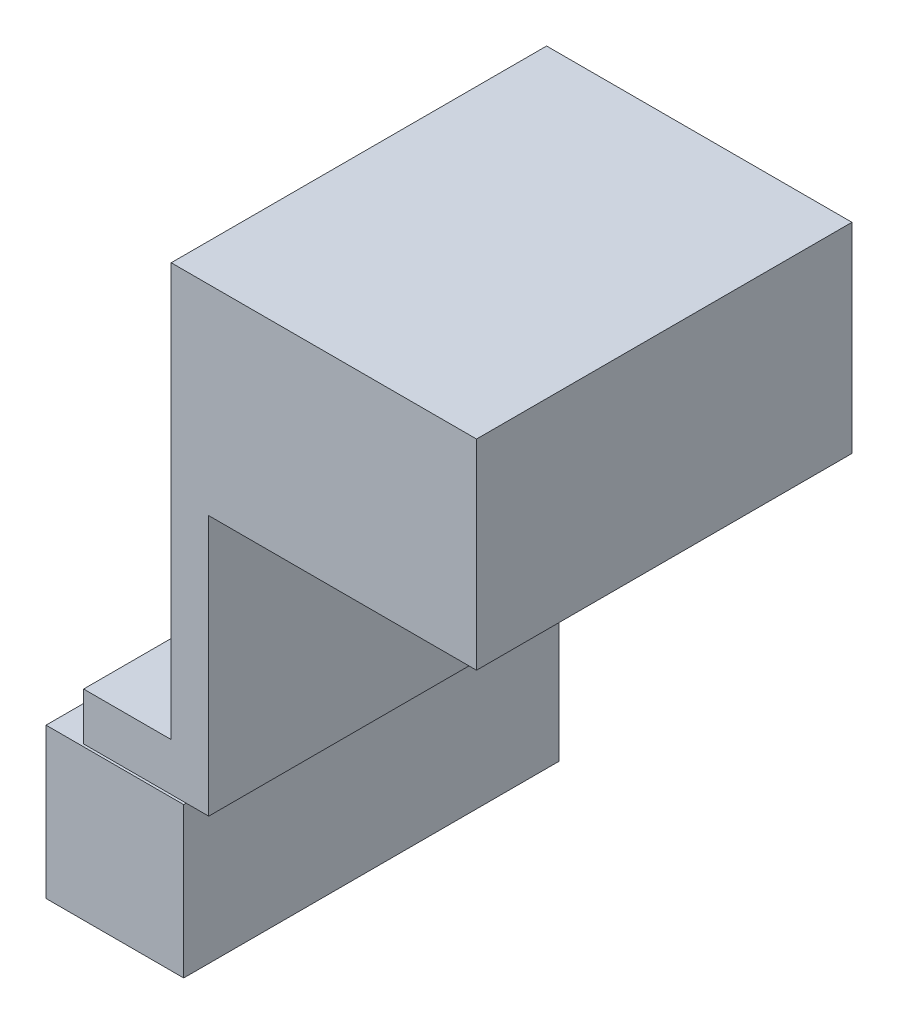
ISO-10303-21;
HEADER;
FILE_DESCRIPTION(('STEP AP214'),'2;1');
FILE_NAME('part.step','',(''),(''),'','','');
FILE_SCHEMA(('AUTOMOTIVE_DESIGN { 1 0 10303 214 1 1 1 1 }'));
ENDSEC;
DATA;
#1=APPLICATION_CONTEXT('core data for automotive mechanical design processes');
#2=APPLICATION_PROTOCOL_DEFINITION('international standard','automotive_design',2000,#1);
#3=PRODUCT_CONTEXT('',#1,'mechanical');
#4=PRODUCT('Part','Part','',(#3));
#5=PRODUCT_RELATED_PRODUCT_CATEGORY('part','',(#4));
#6=PRODUCT_DEFINITION_FORMATION('','',#4);
#7=PRODUCT_DEFINITION_CONTEXT('part definition',#1,'design');
#8=PRODUCT_DEFINITION('design','',#6,#7);
#9=PRODUCT_DEFINITION_SHAPE('','',#8);
#10=(LENGTH_UNIT() NAMED_UNIT(*) SI_UNIT(.MILLI.,.METRE.));
#11=(NAMED_UNIT(*) PLANE_ANGLE_UNIT() SI_UNIT($,.RADIAN.));
#12=(NAMED_UNIT(*) SI_UNIT($,.STERADIAN.) SOLID_ANGLE_UNIT());
#13=UNCERTAINTY_MEASURE_WITH_UNIT(LENGTH_MEASURE(1.E-05),#10,'distance_accuracy_value','');
#14=(GEOMETRIC_REPRESENTATION_CONTEXT(3) GLOBAL_UNCERTAINTY_ASSIGNED_CONTEXT((#13)) GLOBAL_UNIT_ASSIGNED_CONTEXT((#10,
#11,#12)) REPRESENTATION_CONTEXT('',''));
#15=CARTESIAN_POINT('',(0.,0.,0.));
#16=DIRECTION('',(0.,0.,1.));
#17=DIRECTION('',(1.,0.,0.));
#18=AXIS2_PLACEMENT_3D('',#15,#16,#17);
#19=CARTESIAN_POINT('',(40.,0.,150.));
#20=DIRECTION('',(1.,0.,0.));
#21=DIRECTION('',(0.,1.,0.));
#22=AXIS2_PLACEMENT_3D('',#19,#20,#21);
#23=PLANE('',#22);
#24=DIRECTION('',(0.,-1.,0.));
#25=VECTOR('',#24,1.);
#26=CARTESIAN_POINT('',(40.,0.,0.));
#27=LINE('',#26,#25);
#28=CARTESIAN_POINT('',(40.,-1.,0.));
#29=VERTEX_POINT('',#28);
#30=CARTESIAN_POINT('',(40.,-61.,0.));
#31=VERTEX_POINT('',#30);
#32=EDGE_CURVE('E106',#29,#31,#27,.T.);
#33=ORIENTED_EDGE('',*,*,#32,.F.);
#34=DIRECTION('',(0.,0.,-1.));
#35=VECTOR('',#34,1.);
#36=CARTESIAN_POINT('',(40.,-1.,150.));
#37=LINE('',#36,#35);
#38=CARTESIAN_POINT('',(40.,-1.,150.));
#39=VERTEX_POINT('',#38);
#40=EDGE_CURVE('E12',#39,#29,#37,.T.);
#41=ORIENTED_EDGE('',*,*,#40,.F.);
#42=DIRECTION('',(0.,-1.,0.));
#43=VECTOR('',#42,1.);
#44=CARTESIAN_POINT('',(40.,0.,150.));
#45=LINE('',#44,#43);
#46=CARTESIAN_POINT('',(40.,-61.,150.));
#47=VERTEX_POINT('',#46);
#48=EDGE_CURVE('E100',#39,#47,#45,.T.);
#49=ORIENTED_EDGE('',*,*,#48,.T.);
#50=DIRECTION('',(0.,0.,-1.));
#51=VECTOR('',#50,1.);
#52=CARTESIAN_POINT('',(40.,-61.,150.));
#53=LINE('',#52,#51);
#54=EDGE_CURVE('E81',#47,#31,#53,.T.);
#55=ORIENTED_EDGE('',*,*,#54,.T.);
#56=EDGE_LOOP('',(#33,#41,#49,#55));
#57=FACE_BOUND('',#56,.T.);
#58=ADVANCED_FACE('F43',(#57),#23,.T.);
#59=CARTESIAN_POINT('',(0.,-1.,150.));
#60=DIRECTION('',(0.,1.,0.));
#61=DIRECTION('',(0.,0.,1.));
#62=AXIS2_PLACEMENT_3D('',#59,#60,#61);
#63=PLANE('',#62);
#64=DIRECTION('',(1.,0.,0.));
#65=VECTOR('',#64,1.);
#66=CARTESIAN_POINT('',(0.,-1.,0.));
#67=LINE('',#66,#65);
#68=CARTESIAN_POINT('',(-15.,-1.,0.));
#69=VERTEX_POINT('',#68);
#70=EDGE_CURVE('E94',#69,#29,#67,.T.);
#71=ORIENTED_EDGE('',*,*,#70,.F.);
#72=DIRECTION('',(0.,0.,-1.));
#73=VECTOR('',#72,1.);
#74=CARTESIAN_POINT('',(-15.,-1.,150.));
#75=LINE('',#74,#73);
#76=CARTESIAN_POINT('',(-15.,-1.,150.));
#77=VERTEX_POINT('',#76);
#78=EDGE_CURVE('E51',#77,#69,#75,.T.);
#79=ORIENTED_EDGE('',*,*,#78,.F.);
#80=DIRECTION('',(1.,0.,0.));
#81=VECTOR('',#80,1.);
#82=CARTESIAN_POINT('',(0.,-1.,150.));
#83=LINE('',#82,#81);
#84=EDGE_CURVE('E92',#77,#39,#83,.T.);
#85=ORIENTED_EDGE('',*,*,#84,.T.);
#86=ORIENTED_EDGE('',*,*,#40,.T.);
#87=EDGE_LOOP('',(#71,#79,#85,#86));
#88=FACE_BOUND('',#87,.T.);
#89=ADVANCED_FACE('F90',(#88),#63,.T.);
#90=CARTESIAN_POINT('',(-15.,0.,150.));
#91=DIRECTION('',(1.,0.,0.));
#92=DIRECTION('',(0.,1.,0.));
#93=AXIS2_PLACEMENT_3D('',#90,#91,#92);
#94=PLANE('',#93);
#95=DIRECTION('',(0.,-1.,0.));
#96=VECTOR('',#95,1.);
#97=CARTESIAN_POINT('',(-15.,0.,0.));
#98=LINE('',#97,#96);
#99=CARTESIAN_POINT('',(-15.,-61.,0.));
#100=VERTEX_POINT('',#99);
#101=EDGE_CURVE('E74',#69,#100,#98,.T.);
#102=ORIENTED_EDGE('',*,*,#101,.T.);
#103=DIRECTION('',(0.,0.,-1.));
#104=VECTOR('',#103,1.);
#105=CARTESIAN_POINT('',(-15.,-61.,150.));
#106=LINE('',#105,#104);
#107=CARTESIAN_POINT('',(-15.,-61.,150.));
#108=VERTEX_POINT('',#107);
#109=EDGE_CURVE('E95',#108,#100,#106,.T.);
#110=ORIENTED_EDGE('',*,*,#109,.F.);
#111=DIRECTION('',(0.,-1.,0.));
#112=VECTOR('',#111,1.);
#113=CARTESIAN_POINT('',(-15.,0.,150.));
#114=LINE('',#113,#112);
#115=EDGE_CURVE('E96',#77,#108,#114,.T.);
#116=ORIENTED_EDGE('',*,*,#115,.F.);
#117=ORIENTED_EDGE('',*,*,#78,.T.);
#118=EDGE_LOOP('',(#102,#110,#116,#117));
#119=FACE_BOUND('',#118,.T.);
#120=ADVANCED_FACE('F97',(#119),#94,.F.);
#121=CARTESIAN_POINT('',(0.,-61.,150.));
#122=DIRECTION('',(0.,1.,0.));
#123=DIRECTION('',(0.,0.,1.));
#124=AXIS2_PLACEMENT_3D('',#121,#122,#123);
#125=PLANE('',#124);
#126=DIRECTION('',(1.,0.,0.));
#127=VECTOR('',#126,1.);
#128=CARTESIAN_POINT('',(0.,-61.,0.));
#129=LINE('',#128,#127);
#130=EDGE_CURVE('E102',#100,#31,#129,.T.);
#131=ORIENTED_EDGE('',*,*,#130,.T.);
#132=ORIENTED_EDGE('',*,*,#54,.F.);
#133=DIRECTION('',(1.,0.,0.));
#134=VECTOR('',#133,1.);
#135=CARTESIAN_POINT('',(0.,-61.,150.));
#136=LINE('',#135,#134);
#137=EDGE_CURVE('E59',#108,#47,#136,.T.);
#138=ORIENTED_EDGE('',*,*,#137,.F.);
#139=ORIENTED_EDGE('',*,*,#109,.T.);
#140=EDGE_LOOP('',(#131,#132,#138,#139));
#141=FACE_BOUND('',#140,.T.);
#142=ADVANCED_FACE('F115',(#141),#125,.F.);
#143=CARTESIAN_POINT('',(0.,0.,150.));
#144=DIRECTION('',(0.,0.,1.));
#145=DIRECTION('',(1.,0.,0.));
#146=AXIS2_PLACEMENT_3D('',#143,#144,#145);
#147=PLANE('',#146);
#148=ORIENTED_EDGE('',*,*,#48,.F.);
#149=ORIENTED_EDGE('',*,*,#84,.F.);
#150=ORIENTED_EDGE('',*,*,#115,.T.);
#151=ORIENTED_EDGE('',*,*,#137,.T.);
#152=EDGE_LOOP('',(#148,#149,#150,#151));
#153=FACE_BOUND('',#152,.T.);
#154=ADVANCED_FACE('F99',(#153),#147,.T.);
#155=CARTESIAN_POINT('',(0.,0.,0.));
#156=DIRECTION('',(0.,0.,1.));
#157=DIRECTION('',(1.,0.,0.));
#158=AXIS2_PLACEMENT_3D('',#155,#156,#157);
#159=PLANE('',#158);
#160=ORIENTED_EDGE('',*,*,#32,.T.);
#161=ORIENTED_EDGE('',*,*,#130,.F.);
#162=ORIENTED_EDGE('',*,*,#101,.F.);
#163=ORIENTED_EDGE('',*,*,#70,.T.);
#164=EDGE_LOOP('',(#160,#161,#162,#163));
#165=FACE_BOUND('',#164,.T.);
#166=ADVANCED_FACE('F117',(#165),#159,.F.);
#167=CLOSED_SHELL('',(#58,#89,#120,#142,#154,#166));
#168=MANIFOLD_SOLID_BREP('B2',#167);
#169=CARTESIAN_POINT('',(0.,0.,150.));
#170=DIRECTION('',(0.,1.,0.));
#171=DIRECTION('',(0.,0.,1.));
#172=AXIS2_PLACEMENT_3D('',#169,#170,#171);
#173=PLANE('',#172);
#174=DIRECTION('',(1.,0.,0.));
#175=VECTOR('',#174,1.);
#176=CARTESIAN_POINT('',(0.,0.,0.));
#177=LINE('',#176,#175);
#178=CARTESIAN_POINT('',(0.,0.,0.));
#179=VERTEX_POINT('',#178);
#180=CARTESIAN_POINT('',(50.,0.,0.));
#181=VERTEX_POINT('',#180);
#182=EDGE_CURVE('E264',#179,#181,#177,.T.);
#183=ORIENTED_EDGE('',*,*,#182,.T.);
#184=DIRECTION('',(0.,0.,-1.));
#185=VECTOR('',#184,1.);
#186=CARTESIAN_POINT('',(50.,0.,150.));
#187=LINE('',#186,#185);
#188=CARTESIAN_POINT('',(50.,0.,150.));
#189=VERTEX_POINT('',#188);
#190=EDGE_CURVE('E41',#189,#181,#187,.T.);
#191=ORIENTED_EDGE('',*,*,#190,.F.);
#192=DIRECTION('',(1.,0.,0.));
#193=VECTOR('',#192,1.);
#194=CARTESIAN_POINT('',(0.,0.,150.));
#195=LINE('',#194,#193);
#196=CARTESIAN_POINT('',(0.,0.,150.));
#197=VERTEX_POINT('',#196);
#198=EDGE_CURVE('E283',#197,#189,#195,.T.);
#199=ORIENTED_EDGE('',*,*,#198,.F.);
#200=DIRECTION('',(0.,0.,-1.));
#201=VECTOR('',#200,1.);
#202=CARTESIAN_POINT('',(0.,0.,150.));
#203=LINE('',#202,#201);
#204=EDGE_CURVE('E183',#197,#179,#203,.T.);
#205=ORIENTED_EDGE('',*,*,#204,.T.);
#206=EDGE_LOOP('',(#183,#191,#199,#205));
#207=FACE_BOUND('',#206,.T.);
#208=ADVANCED_FACE('F167',(#207),#173,.F.);
#209=CARTESIAN_POINT('',(50.,0.,150.));
#210=DIRECTION('',(-1.,0.,0.));
#211=DIRECTION('',(0.,0.,1.));
#212=AXIS2_PLACEMENT_3D('',#209,#210,#211);
#213=PLANE('',#212);
#214=DIRECTION('',(0.,1.,0.));
#215=VECTOR('',#214,1.);
#216=CARTESIAN_POINT('',(50.,0.,0.));
#217=LINE('',#216,#215);
#218=CARTESIAN_POINT('',(50.,104.,0.));
#219=VERTEX_POINT('',#218);
#220=EDGE_CURVE('E266',#181,#219,#217,.T.);
#221=ORIENTED_EDGE('',*,*,#220,.T.);
#222=DIRECTION('',(0.,0.,-1.));
#223=VECTOR('',#222,1.);
#224=CARTESIAN_POINT('',(50.,104.,150.));
#225=LINE('',#224,#223);
#226=CARTESIAN_POINT('',(50.,104.,150.));
#227=VERTEX_POINT('',#226);
#228=EDGE_CURVE('E175',#227,#219,#225,.T.);
#229=ORIENTED_EDGE('',*,*,#228,.F.);
#230=DIRECTION('',(0.,1.,0.));
#231=VECTOR('',#230,1.);
#232=CARTESIAN_POINT('',(50.,0.,150.));
#233=LINE('',#232,#231);
#234=EDGE_CURVE('E221',#189,#227,#233,.T.);
#235=ORIENTED_EDGE('',*,*,#234,.F.);
#236=ORIENTED_EDGE('',*,*,#190,.T.);
#237=EDGE_LOOP('',(#221,#229,#235,#236));
#238=FACE_BOUND('',#237,.T.);
#239=ADVANCED_FACE('F310',(#238),#213,.F.);
#240=CARTESIAN_POINT('',(0.,104.,150.));
#241=DIRECTION('',(0.,1.,0.));
#242=DIRECTION('',(-1.,0.,0.));
#243=AXIS2_PLACEMENT_3D('',#240,#241,#242);
#244=PLANE('',#243);
#245=DIRECTION('',(1.,0.,0.));
#246=VECTOR('',#245,1.);
#247=CARTESIAN_POINT('',(0.,104.,0.));
#248=LINE('',#247,#246);
#249=CARTESIAN_POINT('',(157.,104.,0.));
#250=VERTEX_POINT('',#249);
#251=EDGE_CURVE('E268',#219,#250,#248,.T.);
#252=ORIENTED_EDGE('',*,*,#251,.T.);
#253=DIRECTION('',(0.,0.,-1.));
#254=VECTOR('',#253,1.);
#255=CARTESIAN_POINT('',(157.,104.,150.));
#256=LINE('',#255,#254);
#257=CARTESIAN_POINT('',(157.,104.,150.));
#258=VERTEX_POINT('',#257);
#259=EDGE_CURVE('E289',#258,#250,#256,.T.);
#260=ORIENTED_EDGE('',*,*,#259,.F.);
#261=DIRECTION('',(1.,0.,0.));
#262=VECTOR('',#261,1.);
#263=CARTESIAN_POINT('',(0.,104.,150.));
#264=LINE('',#263,#262);
#265=EDGE_CURVE('E296',#227,#258,#264,.T.);
#266=ORIENTED_EDGE('',*,*,#265,.F.);
#267=ORIENTED_EDGE('',*,*,#228,.T.);
#268=EDGE_LOOP('',(#252,#260,#266,#267));
#269=FACE_BOUND('',#268,.T.);
#270=ADVANCED_FACE('F294',(#269),#244,.F.);
#271=CARTESIAN_POINT('',(157.,0.,150.));
#272=DIRECTION('',(1.,0.,0.));
#273=DIRECTION('',(0.,0.,-1.));
#274=AXIS2_PLACEMENT_3D('',#271,#272,#273);
#275=PLANE('',#274);
#276=DIRECTION('',(0.,-1.,0.));
#277=VECTOR('',#276,1.);
#278=CARTESIAN_POINT('',(157.,0.,0.));
#279=LINE('',#278,#277);
#280=CARTESIAN_POINT('',(157.,184.,0.));
#281=VERTEX_POINT('',#280);
#282=EDGE_CURVE('E271',#281,#250,#279,.T.);
#283=ORIENTED_EDGE('',*,*,#282,.F.);
#284=DIRECTION('',(0.,0.,-1.));
#285=VECTOR('',#284,1.);
#286=CARTESIAN_POINT('',(157.,184.,150.));
#287=LINE('',#286,#285);
#288=CARTESIAN_POINT('',(157.,184.,150.));
#289=VERTEX_POINT('',#288);
#290=EDGE_CURVE('E287',#289,#281,#287,.T.);
#291=ORIENTED_EDGE('',*,*,#290,.F.);
#292=DIRECTION('',(0.,-1.,0.));
#293=VECTOR('',#292,1.);
#294=CARTESIAN_POINT('',(157.,0.,150.));
#295=LINE('',#294,#293);
#296=EDGE_CURVE('E304',#289,#258,#295,.T.);
#297=ORIENTED_EDGE('',*,*,#296,.T.);
#298=ORIENTED_EDGE('',*,*,#259,.T.);
#299=EDGE_LOOP('',(#283,#291,#297,#298));
#300=FACE_BOUND('',#299,.T.);
#301=ADVANCED_FACE('F302',(#300),#275,.T.);
#302=CARTESIAN_POINT('',(0.,184.,150.));
#303=DIRECTION('',(0.,-1.,0.));
#304=DIRECTION('',(0.,0.,-1.));
#305=AXIS2_PLACEMENT_3D('',#302,#303,#304);
#306=PLANE('',#305);
#307=DIRECTION('',(-1.,0.,0.));
#308=VECTOR('',#307,1.);
#309=CARTESIAN_POINT('',(0.,184.,0.));
#310=LINE('',#309,#308);
#311=CARTESIAN_POINT('',(35.,184.,0.));
#312=VERTEX_POINT('',#311);
#313=EDGE_CURVE('E274',#281,#312,#310,.T.);
#314=ORIENTED_EDGE('',*,*,#313,.T.);
#315=DIRECTION('',(0.,0.,-1.));
#316=VECTOR('',#315,1.);
#317=CARTESIAN_POINT('',(35.,184.,150.));
#318=LINE('',#317,#316);
#319=CARTESIAN_POINT('',(35.,184.,150.));
#320=VERTEX_POINT('',#319);
#321=EDGE_CURVE('E246',#320,#312,#318,.T.);
#322=ORIENTED_EDGE('',*,*,#321,.F.);
#323=DIRECTION('',(-1.,0.,0.));
#324=VECTOR('',#323,1.);
#325=CARTESIAN_POINT('',(0.,184.,150.));
#326=LINE('',#325,#324);
#327=EDGE_CURVE('E255',#289,#320,#326,.T.);
#328=ORIENTED_EDGE('',*,*,#327,.F.);
#329=ORIENTED_EDGE('',*,*,#290,.T.);
#330=EDGE_LOOP('',(#314,#322,#328,#329));
#331=FACE_BOUND('',#330,.T.);
#332=ADVANCED_FACE('F320',(#331),#306,.F.);
#333=CARTESIAN_POINT('',(35.,0.,150.));
#334=DIRECTION('',(-1.,0.,0.));
#335=DIRECTION('',(0.,0.,1.));
#336=AXIS2_PLACEMENT_3D('',#333,#334,#335);
#337=PLANE('',#336);
#338=DIRECTION('',(0.,1.,0.));
#339=VECTOR('',#338,1.);
#340=CARTESIAN_POINT('',(35.,0.,0.));
#341=LINE('',#340,#339);
#342=CARTESIAN_POINT('',(35.,19.,0.));
#343=VERTEX_POINT('',#342);
#344=EDGE_CURVE('E242',#343,#312,#341,.T.);
#345=ORIENTED_EDGE('',*,*,#344,.F.);
#346=DIRECTION('',(0.,0.,-1.));
#347=VECTOR('',#346,1.);
#348=CARTESIAN_POINT('',(35.,19.,150.));
#349=LINE('',#348,#347);
#350=CARTESIAN_POINT('',(35.,19.,150.));
#351=VERTEX_POINT('',#350);
#352=EDGE_CURVE('E237',#351,#343,#349,.T.);
#353=ORIENTED_EDGE('',*,*,#352,.F.);
#354=DIRECTION('',(0.,1.,0.));
#355=VECTOR('',#354,1.);
#356=CARTESIAN_POINT('',(35.,0.,150.));
#357=LINE('',#356,#355);
#358=EDGE_CURVE('E240',#351,#320,#357,.T.);
#359=ORIENTED_EDGE('',*,*,#358,.T.);
#360=ORIENTED_EDGE('',*,*,#321,.T.);
#361=EDGE_LOOP('',(#345,#353,#359,#360));
#362=FACE_BOUND('',#361,.T.);
#363=ADVANCED_FACE('F239',(#362),#337,.T.);
#364=CARTESIAN_POINT('',(0.,19.,150.));
#365=DIRECTION('',(0.,1.,0.));
#366=DIRECTION('',(0.,0.,1.));
#367=AXIS2_PLACEMENT_3D('',#364,#365,#366);
#368=PLANE('',#367);
#369=DIRECTION('',(1.,0.,0.));
#370=VECTOR('',#369,1.);
#371=CARTESIAN_POINT('',(0.,19.,0.));
#372=LINE('',#371,#370);
#373=CARTESIAN_POINT('',(0.,19.,0.));
#374=VERTEX_POINT('',#373);
#375=EDGE_CURVE('E278',#374,#343,#372,.T.);
#376=ORIENTED_EDGE('',*,*,#375,.F.);
#377=DIRECTION('',(0.,0.,-1.));
#378=VECTOR('',#377,1.);
#379=CARTESIAN_POINT('',(0.,19.,150.));
#380=LINE('',#379,#378);
#381=CARTESIAN_POINT('',(0.,19.,150.));
#382=VERTEX_POINT('',#381);
#383=EDGE_CURVE('E209',#382,#374,#380,.T.);
#384=ORIENTED_EDGE('',*,*,#383,.F.);
#385=DIRECTION('',(1.,0.,0.));
#386=VECTOR('',#385,1.);
#387=CARTESIAN_POINT('',(0.,19.,150.));
#388=LINE('',#387,#386);
#389=EDGE_CURVE('E252',#382,#351,#388,.T.);
#390=ORIENTED_EDGE('',*,*,#389,.T.);
#391=ORIENTED_EDGE('',*,*,#352,.T.);
#392=EDGE_LOOP('',(#376,#384,#390,#391));
#393=FACE_BOUND('',#392,.T.);
#394=ADVANCED_FACE('F258',(#393),#368,.T.);
#395=CARTESIAN_POINT('',(0.,0.,150.));
#396=DIRECTION('',(-1.,0.,0.));
#397=DIRECTION('',(0.,0.,1.));
#398=AXIS2_PLACEMENT_3D('',#395,#396,#397);
#399=PLANE('',#398);
#400=DIRECTION('',(0.,1.,0.));
#401=VECTOR('',#400,1.);
#402=CARTESIAN_POINT('',(0.,0.,0.));
#403=LINE('',#402,#401);
#404=EDGE_CURVE('E280',#179,#374,#403,.T.);
#405=ORIENTED_EDGE('',*,*,#404,.F.);
#406=ORIENTED_EDGE('',*,*,#204,.F.);
#407=DIRECTION('',(0.,1.,0.));
#408=VECTOR('',#407,1.);
#409=CARTESIAN_POINT('',(0.,0.,150.));
#410=LINE('',#409,#408);
#411=EDGE_CURVE('E259',#197,#382,#410,.T.);
#412=ORIENTED_EDGE('',*,*,#411,.T.);
#413=ORIENTED_EDGE('',*,*,#383,.T.);
#414=EDGE_LOOP('',(#405,#406,#412,#413));
#415=FACE_BOUND('',#414,.T.);
#416=ADVANCED_FACE('F328',(#415),#399,.T.);
#417=CARTESIAN_POINT('',(0.,0.,150.));
#418=DIRECTION('',(0.,0.,1.));
#419=DIRECTION('',(1.,0.,0.));
#420=AXIS2_PLACEMENT_3D('',#417,#418,#419);
#421=PLANE('',#420);
#422=ORIENTED_EDGE('',*,*,#198,.T.);
#423=ORIENTED_EDGE('',*,*,#234,.T.);
#424=ORIENTED_EDGE('',*,*,#265,.T.);
#425=ORIENTED_EDGE('',*,*,#296,.F.);
#426=ORIENTED_EDGE('',*,*,#327,.T.);
#427=ORIENTED_EDGE('',*,*,#358,.F.);
#428=ORIENTED_EDGE('',*,*,#389,.F.);
#429=ORIENTED_EDGE('',*,*,#411,.F.);
#430=EDGE_LOOP('',(#422,#423,#424,#425,#426,#427,#428,#429));
#431=FACE_BOUND('',#430,.T.);
#432=ADVANCED_FACE('F250',(#431),#421,.T.);
#433=CARTESIAN_POINT('',(0.,0.,0.));
#434=DIRECTION('',(0.,0.,1.));
#435=DIRECTION('',(1.,0.,0.));
#436=AXIS2_PLACEMENT_3D('',#433,#434,#435);
#437=PLANE('',#436);
#438=ORIENTED_EDGE('',*,*,#182,.F.);
#439=ORIENTED_EDGE('',*,*,#404,.T.);
#440=ORIENTED_EDGE('',*,*,#375,.T.);
#441=ORIENTED_EDGE('',*,*,#344,.T.);
#442=ORIENTED_EDGE('',*,*,#313,.F.);
#443=ORIENTED_EDGE('',*,*,#282,.T.);
#444=ORIENTED_EDGE('',*,*,#251,.F.);
#445=ORIENTED_EDGE('',*,*,#220,.F.);
#446=EDGE_LOOP('',(#438,#439,#440,#441,#442,#443,#444,#445));
#447=FACE_BOUND('',#446,.T.);
#448=ADVANCED_FACE('F298',(#447),#437,.F.);
#449=CLOSED_SHELL('',(#208,#239,#270,#301,#332,#363,#394,#416,#432,#448));
#450=MANIFOLD_SOLID_BREP('B6',#449);
#451=ADVANCED_BREP_SHAPE_REPRESENTATION('',(#18,#168,#450),#14);
#452=SHAPE_DEFINITION_REPRESENTATION(#9,#451);
ENDSEC;
END-ISO-10303-21;
